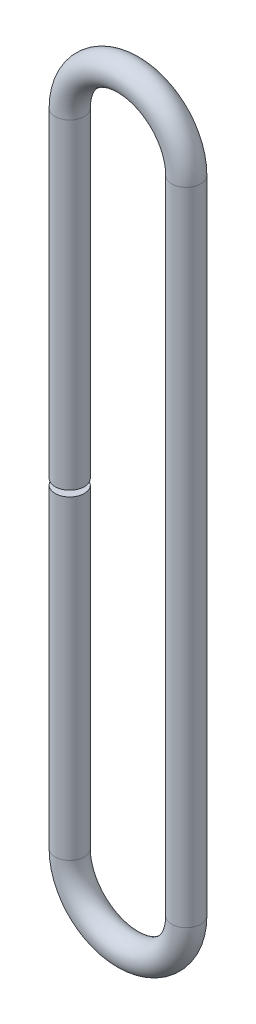
ISO-10303-21;
HEADER;
FILE_DESCRIPTION(('STEP AP214'),'2;1');
FILE_NAME('part.step','',(''),(''),'','','');
FILE_SCHEMA(('AUTOMOTIVE_DESIGN { 1 0 10303 214 1 1 1 1 }'));
ENDSEC;
DATA;
#1=APPLICATION_CONTEXT('core data for automotive mechanical design processes');
#2=APPLICATION_PROTOCOL_DEFINITION('international standard','automotive_design',2000,#1);
#3=PRODUCT_CONTEXT('',#1,'mechanical');
#4=PRODUCT('Part','Part','',(#3));
#5=PRODUCT_RELATED_PRODUCT_CATEGORY('part','',(#4));
#6=PRODUCT_DEFINITION_FORMATION('','',#4);
#7=PRODUCT_DEFINITION_CONTEXT('part definition',#1,'design');
#8=PRODUCT_DEFINITION('design','',#6,#7);
#9=PRODUCT_DEFINITION_SHAPE('','',#8);
#10=(LENGTH_UNIT() NAMED_UNIT(*) SI_UNIT(.MILLI.,.METRE.));
#11=(NAMED_UNIT(*) PLANE_ANGLE_UNIT() SI_UNIT($,.RADIAN.));
#12=(NAMED_UNIT(*) SI_UNIT($,.STERADIAN.) SOLID_ANGLE_UNIT());
#13=UNCERTAINTY_MEASURE_WITH_UNIT(LENGTH_MEASURE(1.E-05),#10,'distance_accuracy_value','');
#14=(GEOMETRIC_REPRESENTATION_CONTEXT(3) GLOBAL_UNCERTAINTY_ASSIGNED_CONTEXT((#13)) GLOBAL_UNIT_ASSIGNED_CONTEXT((#10,
#11,#12)) REPRESENTATION_CONTEXT('',''));
#15=CARTESIAN_POINT('',(0.,0.,0.));
#16=DIRECTION('',(0.,0.,1.));
#17=DIRECTION('',(1.,0.,0.));
#18=AXIS2_PLACEMENT_3D('',#15,#16,#17);
#19=CARTESIAN_POINT('',(0.,0.1,0.));
#20=DIRECTION('',(0.,1.,0.));
#21=DIRECTION('',(0.,0.,1.));
#22=AXIS2_PLACEMENT_3D('',#19,#20,#21);
#23=PLANE('',#22);
#24=CARTESIAN_POINT('',(0.,0.1,0.));
#25=DIRECTION('',(0.,1.,0.));
#26=DIRECTION('',(0.,0.,1.));
#27=AXIS2_PLACEMENT_3D('',#24,#25,#26);
#28=CIRCLE('',#27,0.5);
#29=CARTESIAN_POINT('',(0.,0.1,0.5));
#30=VERTEX_POINT('',#29);
#31=EDGE_CURVE('E45',#30,#30,#28,.T.);
#32=ORIENTED_EDGE('',*,*,#31,.F.);
#33=EDGE_LOOP('',(#32));
#34=FACE_BOUND('',#33,.T.);
#35=ADVANCED_FACE('F33',(#34),#23,.F.);
#36=CARTESIAN_POINT('',(0.,-0.100000000000003,0.));
#37=DIRECTION('',(0.,1.,0.));
#38=DIRECTION('',(0.,0.,1.));
#39=AXIS2_PLACEMENT_3D('',#36,#37,#38);
#40=PLANE('',#39);
#41=CARTESIAN_POINT('',(0.,-0.100000000000003,0.));
#42=DIRECTION('',(0.,1.,0.));
#43=DIRECTION('',(0.,0.,1.));
#44=AXIS2_PLACEMENT_3D('',#41,#42,#43);
#45=CIRCLE('',#44,0.5);
#46=CARTESIAN_POINT('',(0.,-0.100000000000003,0.5));
#47=VERTEX_POINT('',#46);
#48=EDGE_CURVE('E11',#47,#47,#45,.T.);
#49=ORIENTED_EDGE('',*,*,#48,.T.);
#50=EDGE_LOOP('',(#49));
#51=FACE_BOUND('',#50,.T.);
#52=ADVANCED_FACE('F48',(#51),#40,.T.);
#53=CARTESIAN_POINT('',(0.,0.1,0.));
#54=DIRECTION('',(0.,1.,0.));
#55=DIRECTION('',(0.,0.,1.));
#56=AXIS2_PLACEMENT_3D('',#53,#54,#55);
#57=CYLINDRICAL_SURFACE('',#56,0.5);
#58=CARTESIAN_POINT('',(0.,11.1,0.));
#59=DIRECTION('',(0.,1.,0.));
#60=DIRECTION('',(0.,0.,1.));
#61=AXIS2_PLACEMENT_3D('',#58,#59,#60);
#62=CIRCLE('',#61,0.5);
#63=CARTESIAN_POINT('',(-0.5,11.1,0.));
#64=VERTEX_POINT('',#63);
#65=EDGE_CURVE('E65',#64,#64,#62,.T.);
#66=ORIENTED_EDGE('',*,*,#65,.F.);
#67=EDGE_LOOP('',(#66));
#68=FACE_BOUND('',#67,.T.);
#69=ORIENTED_EDGE('',*,*,#31,.T.);
#70=EDGE_LOOP('',(#69));
#71=FACE_BOUND('',#70,.T.);
#72=ADVANCED_FACE('F69',(#68,#71),#57,.T.);
#73=CARTESIAN_POINT('',(2.,11.1,0.));
#74=DIRECTION('',(0.,0.,-1.));
#75=DIRECTION('',(-1.,0.,0.));
#76=AXIS2_PLACEMENT_3D('',#73,#74,#75);
#77=TOROIDAL_SURFACE('',#76,2.,0.5);
#78=CARTESIAN_POINT('',(4.,11.1,0.));
#79=DIRECTION('',(0.,-1.,0.));
#80=DIRECTION('',(0.,0.,1.));
#81=AXIS2_PLACEMENT_3D('',#78,#79,#80);
#82=CIRCLE('',#81,0.5);
#83=CARTESIAN_POINT('',(4.5,11.1,0.));
#84=VERTEX_POINT('',#83);
#85=EDGE_CURVE('E60',#84,#84,#82,.T.);
#86=CARTESIAN_POINT('',(2.,11.1,0.));
#87=DIRECTION('',(0.,0.,-1.));
#88=DIRECTION('',(-1.,0.,0.));
#89=AXIS2_PLACEMENT_3D('',#86,#87,#88);
#90=CIRCLE('',#89,2.5);
#91=EDGE_CURVE('',#64,#84,#90,.T.);
#92=ORIENTED_EDGE('',*,*,#65,.T.);
#93=ORIENTED_EDGE('',*,*,#85,.F.);
#94=ORIENTED_EDGE('',*,*,#91,.T.);
#95=ORIENTED_EDGE('',*,*,#91,.F.);
#96=EDGE_LOOP('',(#92,#94,#93,#95));
#97=FACE_BOUND('',#96,.T.);
#98=ADVANCED_FACE('F71',(#97),#77,.T.);
#99=CARTESIAN_POINT('',(4.,11.1,0.));
#100=DIRECTION('',(0.,-1.,0.));
#101=DIRECTION('',(1.,0.,0.));
#102=AXIS2_PLACEMENT_3D('',#99,#100,#101);
#103=CYLINDRICAL_SURFACE('',#102,0.5);
#104=CARTESIAN_POINT('',(4.,-10.9,0.));
#105=DIRECTION('',(0.,-1.,0.));
#106=DIRECTION('',(0.,0.,1.));
#107=AXIS2_PLACEMENT_3D('',#104,#105,#106);
#108=CIRCLE('',#107,0.5);
#109=CARTESIAN_POINT('',(4.5,-10.9,0.));
#110=VERTEX_POINT('',#109);
#111=EDGE_CURVE('E58',#110,#110,#108,.T.);
#112=ORIENTED_EDGE('',*,*,#111,.F.);
#113=EDGE_LOOP('',(#112));
#114=FACE_BOUND('',#113,.T.);
#115=ORIENTED_EDGE('',*,*,#85,.T.);
#116=EDGE_LOOP('',(#115));
#117=FACE_BOUND('',#116,.T.);
#118=ADVANCED_FACE('F78',(#114,#117),#103,.T.);
#119=CARTESIAN_POINT('',(2.,-10.9,0.));
#120=DIRECTION('',(0.,0.,-1.));
#121=DIRECTION('',(-1.,0.,0.));
#122=AXIS2_PLACEMENT_3D('',#119,#120,#121);
#123=TOROIDAL_SURFACE('',#122,2.,0.5);
#124=CARTESIAN_POINT('',(0.,-10.9,0.));
#125=DIRECTION('',(0.,1.,0.));
#126=DIRECTION('',(0.,0.,1.));
#127=AXIS2_PLACEMENT_3D('',#124,#125,#126);
#128=CIRCLE('',#127,0.5);
#129=CARTESIAN_POINT('',(-0.5,-10.9,0.));
#130=VERTEX_POINT('',#129);
#131=EDGE_CURVE('E40',#130,#130,#128,.T.);
#132=CARTESIAN_POINT('',(2.,-10.9,0.));
#133=DIRECTION('',(0.,0.,-1.));
#134=DIRECTION('',(-1.,0.,0.));
#135=AXIS2_PLACEMENT_3D('',#132,#133,#134);
#136=CIRCLE('',#135,2.5);
#137=EDGE_CURVE('',#110,#130,#136,.T.);
#138=ORIENTED_EDGE('',*,*,#111,.T.);
#139=ORIENTED_EDGE('',*,*,#131,.F.);
#140=ORIENTED_EDGE('',*,*,#137,.T.);
#141=ORIENTED_EDGE('',*,*,#137,.F.);
#142=EDGE_LOOP('',(#138,#140,#139,#141));
#143=FACE_BOUND('',#142,.T.);
#144=ADVANCED_FACE('F53',(#143),#123,.T.);
#145=CARTESIAN_POINT('',(0.,-10.9,0.));
#146=DIRECTION('',(0.,1.,0.));
#147=DIRECTION('',(0.,0.,1.));
#148=AXIS2_PLACEMENT_3D('',#145,#146,#147);
#149=CYLINDRICAL_SURFACE('',#148,0.5);
#150=ORIENTED_EDGE('',*,*,#48,.F.);
#151=EDGE_LOOP('',(#150));
#152=FACE_BOUND('',#151,.T.);
#153=ORIENTED_EDGE('',*,*,#131,.T.);
#154=EDGE_LOOP('',(#153));
#155=FACE_BOUND('',#154,.T.);
#156=ADVANCED_FACE('F50',(#152,#155),#149,.T.);
#157=CLOSED_SHELL('',(#35,#52,#72,#98,#118,#144,#156));
#158=MANIFOLD_SOLID_BREP('B2',#157);
#159=ADVANCED_BREP_SHAPE_REPRESENTATION('',(#18,#158),#14);
#160=SHAPE_DEFINITION_REPRESENTATION(#9,#159);
ENDSEC;
END-ISO-10303-21;
